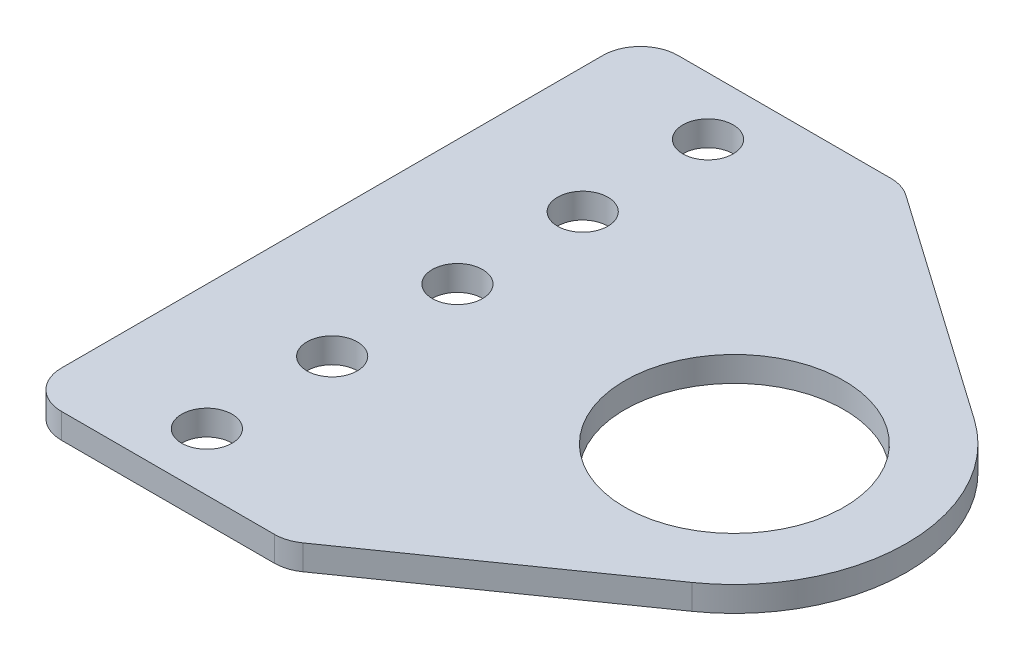
ISO-10303-21;
HEADER;
FILE_DESCRIPTION(('STEP AP214'),'2;1');
FILE_NAME('part.step','',(''),(''),'','','');
FILE_SCHEMA(('AUTOMOTIVE_DESIGN { 1 0 10303 214 1 1 1 1 }'));
ENDSEC;
DATA;
#1=APPLICATION_CONTEXT('core data for automotive mechanical design processes');
#2=APPLICATION_PROTOCOL_DEFINITION('international standard','automotive_design',2000,#1);
#3=PRODUCT_CONTEXT('',#1,'mechanical');
#4=PRODUCT('Part','Part','',(#3));
#5=PRODUCT_RELATED_PRODUCT_CATEGORY('part','',(#4));
#6=PRODUCT_DEFINITION_FORMATION('','',#4);
#7=PRODUCT_DEFINITION_CONTEXT('part definition',#1,'design');
#8=PRODUCT_DEFINITION('design','',#6,#7);
#9=PRODUCT_DEFINITION_SHAPE('','',#8);
#10=(LENGTH_UNIT() NAMED_UNIT(*) SI_UNIT(.MILLI.,.METRE.));
#11=(NAMED_UNIT(*) PLANE_ANGLE_UNIT() SI_UNIT($,.RADIAN.));
#12=(NAMED_UNIT(*) SI_UNIT($,.STERADIAN.) SOLID_ANGLE_UNIT());
#13=UNCERTAINTY_MEASURE_WITH_UNIT(LENGTH_MEASURE(1.E-05),#10,'distance_accuracy_value','');
#14=(GEOMETRIC_REPRESENTATION_CONTEXT(3) GLOBAL_UNCERTAINTY_ASSIGNED_CONTEXT((#13)) GLOBAL_UNIT_ASSIGNED_CONTEXT((#10,
#11,#12)) REPRESENTATION_CONTEXT('',''));
#15=CARTESIAN_POINT('',(0.,0.,0.));
#16=DIRECTION('',(0.,0.,1.));
#17=DIRECTION('',(1.,0.,0.));
#18=AXIS2_PLACEMENT_3D('',#15,#16,#17);
#19=CARTESIAN_POINT('',(-15.375,2.54,27.44));
#20=DIRECTION('',(0.,1.,0.));
#21=DIRECTION('',(0.,0.,1.));
#22=AXIS2_PLACEMENT_3D('',#19,#20,#21);
#23=PLANE('',#22);
#24=CARTESIAN_POINT('',(-28.075,2.54,12.7));
#25=DIRECTION('',(0.,1.,0.));
#26=DIRECTION('',(0.,0.,1.));
#27=AXIS2_PLACEMENT_3D('',#24,#25,#26);
#28=CIRCLE('',#27,2.5527);
#29=CARTESIAN_POINT('',(-28.075,2.54,15.2527));
#30=VERTEX_POINT('',#29);
#31=EDGE_CURVE('E279',#30,#30,#28,.T.);
#32=ORIENTED_EDGE('',*,*,#31,.F.);
#33=EDGE_LOOP('',(#32));
#34=FACE_BOUND('',#33,.T.);
#35=CARTESIAN_POINT('',(-28.075,2.54,-12.7));
#36=DIRECTION('',(0.,1.,0.));
#37=DIRECTION('',(0.,0.,1.));
#38=AXIS2_PLACEMENT_3D('',#35,#36,#37);
#39=CIRCLE('',#38,2.5527);
#40=CARTESIAN_POINT('',(-28.075,2.54,-10.1473));
#41=VERTEX_POINT('',#40);
#42=EDGE_CURVE('E263',#41,#41,#39,.T.);
#43=ORIENTED_EDGE('',*,*,#42,.F.);
#44=EDGE_LOOP('',(#43));
#45=FACE_BOUND('',#44,.T.);
#46=CARTESIAN_POINT('',(0.,2.54,0.));
#47=DIRECTION('',(0.,1.,0.));
#48=DIRECTION('',(0.,0.,1.));
#49=AXIS2_PLACEMENT_3D('',#46,#47,#48);
#50=CIRCLE('',#49,11.1125);
#51=CARTESIAN_POINT('',(0.,2.54,11.1125));
#52=VERTEX_POINT('',#51);
#53=EDGE_CURVE('E159',#52,#52,#50,.T.);
#54=ORIENTED_EDGE('',*,*,#53,.F.);
#55=EDGE_LOOP('',(#54));
#56=FACE_BOUND('',#55,.T.);
#57=CARTESIAN_POINT('',(-15.375,2.54,27.44));
#58=DIRECTION('',(0.,1.,0.));
#59=DIRECTION('',(0.,0.,1.));
#60=AXIS2_PLACEMENT_3D('',#57,#58,#59);
#61=CIRCLE('',#60,3.81);
#62=CARTESIAN_POINT('',(-15.375,2.54,31.25));
#63=VERTEX_POINT('',#62);
#64=CARTESIAN_POINT('',(-13.1889805318271,2.54,30.5604837581326));
#65=VERTEX_POINT('',#64);
#66=EDGE_CURVE('E183',#63,#65,#61,.T.);
#67=ORIENTED_EDGE('',*,*,#66,.T.);
#68=DIRECTION('',(0.819024608433747,0.,-0.573758390596553));
#69=VECTOR('',#68,1.);
#70=CARTESIAN_POINT('',(-13.1889805318271,2.54,30.5604837581326));
#71=LINE('',#70,#69);
#72=CARTESIAN_POINT('',(10.0192558957923,2.54,14.3022172247743));
#73=VERTEX_POINT('',#72);
#74=EDGE_CURVE('E106',#65,#73,#71,.T.);
#75=ORIENTED_EDGE('',*,*,#74,.T.);
#76=CARTESIAN_POINT('',(0.,2.54,0.));
#77=DIRECTION('',(0.,1.,0.));
#78=DIRECTION('',(0.,0.,1.));
#79=AXIS2_PLACEMENT_3D('',#76,#77,#78);
#80=CIRCLE('',#79,17.4625);
#81=CARTESIAN_POINT('',(10.0192558957923,2.54,-14.3022172247743));
#82=VERTEX_POINT('',#81);
#83=EDGE_CURVE('E213',#73,#82,#80,.T.);
#84=ORIENTED_EDGE('',*,*,#83,.T.);
#85=DIRECTION('',(-0.819024608433748,0.,-0.573758390596553));
#86=VECTOR('',#85,1.);
#87=CARTESIAN_POINT('',(10.0192558957923,2.54,-14.3022172247743));
#88=LINE('',#87,#86);
#89=CARTESIAN_POINT('',(-13.1889805318271,2.54,-30.5604837581326));
#90=VERTEX_POINT('',#89);
#91=EDGE_CURVE('E233',#82,#90,#88,.T.);
#92=ORIENTED_EDGE('',*,*,#91,.T.);
#93=CARTESIAN_POINT('',(-15.375,2.54,-27.44));
#94=DIRECTION('',(0.,1.,0.));
#95=DIRECTION('',(0.,0.,-1.));
#96=AXIS2_PLACEMENT_3D('',#93,#94,#95);
#97=CIRCLE('',#96,3.81);
#98=CARTESIAN_POINT('',(-15.375,2.54,-31.25));
#99=VERTEX_POINT('',#98);
#100=EDGE_CURVE('E229',#90,#99,#97,.T.);
#101=ORIENTED_EDGE('',*,*,#100,.T.);
#102=DIRECTION('',(-1.,0.,0.));
#103=VECTOR('',#102,1.);
#104=CARTESIAN_POINT('',(-36.965,2.54,-31.25));
#105=LINE('',#104,#103);
#106=CARTESIAN_POINT('',(-36.965,2.54,-31.25));
#107=VERTEX_POINT('',#106);
#108=EDGE_CURVE('E232',#99,#107,#105,.T.);
#109=ORIENTED_EDGE('',*,*,#108,.T.);
#110=CARTESIAN_POINT('',(-36.965,2.54,-27.44));
#111=DIRECTION('',(0.,1.,0.));
#112=DIRECTION('',(0.,0.,1.));
#113=AXIS2_PLACEMENT_3D('',#110,#111,#112);
#114=CIRCLE('',#113,3.81);
#115=CARTESIAN_POINT('',(-40.775,2.54,-27.44));
#116=VERTEX_POINT('',#115);
#117=EDGE_CURVE('E131',#107,#116,#114,.T.);
#118=ORIENTED_EDGE('',*,*,#117,.T.);
#119=DIRECTION('',(0.,0.,1.));
#120=VECTOR('',#119,1.);
#121=CARTESIAN_POINT('',(-40.775,2.54,27.44));
#122=LINE('',#121,#120);
#123=CARTESIAN_POINT('',(-40.775,2.54,27.44));
#124=VERTEX_POINT('',#123);
#125=EDGE_CURVE('E125',#116,#124,#122,.T.);
#126=ORIENTED_EDGE('',*,*,#125,.T.);
#127=CARTESIAN_POINT('',(-36.965,2.54,27.44));
#128=DIRECTION('',(0.,1.,0.));
#129=DIRECTION('',(0.,0.,1.));
#130=AXIS2_PLACEMENT_3D('',#127,#128,#129);
#131=CIRCLE('',#130,3.81);
#132=CARTESIAN_POINT('',(-36.965,2.54,31.25));
#133=VERTEX_POINT('',#132);
#134=EDGE_CURVE('E129',#124,#133,#131,.T.);
#135=ORIENTED_EDGE('',*,*,#134,.T.);
#136=DIRECTION('',(1.,0.,0.));
#137=VECTOR('',#136,1.);
#138=CARTESIAN_POINT('',(-15.375,2.54,31.25));
#139=LINE('',#138,#137);
#140=EDGE_CURVE('E57',#133,#63,#139,.T.);
#141=ORIENTED_EDGE('',*,*,#140,.T.);
#142=EDGE_LOOP('',(#67,#75,#84,#92,#101,#109,#118,#126,#135,#141));
#143=FACE_BOUND('',#142,.T.);
#144=CARTESIAN_POINT('',(-28.075,2.54,-25.4));
#145=DIRECTION('',(0.,1.,0.));
#146=DIRECTION('',(0.,0.,1.));
#147=AXIS2_PLACEMENT_3D('',#144,#145,#146);
#148=CIRCLE('',#147,2.5527);
#149=CARTESIAN_POINT('',(-28.075,2.54,-22.8473));
#150=VERTEX_POINT('',#149);
#151=EDGE_CURVE('E255',#150,#150,#148,.T.);
#152=ORIENTED_EDGE('',*,*,#151,.F.);
#153=EDGE_LOOP('',(#152));
#154=FACE_BOUND('',#153,.T.);
#155=CARTESIAN_POINT('',(-28.075,2.54,0.));
#156=DIRECTION('',(0.,1.,0.));
#157=DIRECTION('',(0.,0.,1.));
#158=AXIS2_PLACEMENT_3D('',#155,#156,#157);
#159=CIRCLE('',#158,2.55269999999999);
#160=CARTESIAN_POINT('',(-28.075,2.54,2.55269999999999));
#161=VERTEX_POINT('',#160);
#162=EDGE_CURVE('E271',#161,#161,#159,.T.);
#163=ORIENTED_EDGE('',*,*,#162,.F.);
#164=EDGE_LOOP('',(#163));
#165=FACE_BOUND('',#164,.T.);
#166=CARTESIAN_POINT('',(-28.075,2.54,25.4));
#167=DIRECTION('',(0.,1.,0.));
#168=DIRECTION('',(0.,0.,1.));
#169=AXIS2_PLACEMENT_3D('',#166,#167,#168);
#170=CIRCLE('',#169,2.5527);
#171=CARTESIAN_POINT('',(-28.075,2.54,27.9527));
#172=VERTEX_POINT('',#171);
#173=EDGE_CURVE('E287',#172,#172,#170,.T.);
#174=ORIENTED_EDGE('',*,*,#173,.F.);
#175=EDGE_LOOP('',(#174));
#176=FACE_BOUND('',#175,.T.);
#177=ADVANCED_FACE('F39',(#34,#45,#56,#143,#154,#165,#176),#23,.T.);
#178=CARTESIAN_POINT('',(-15.375,0.,27.44));
#179=DIRECTION('',(0.,1.,0.));
#180=DIRECTION('',(0.,0.,1.));
#181=AXIS2_PLACEMENT_3D('',#178,#179,#180);
#182=PLANE('',#181);
#183=CARTESIAN_POINT('',(-15.375,0.,27.44));
#184=DIRECTION('',(0.,1.,0.));
#185=DIRECTION('',(0.,0.,1.));
#186=AXIS2_PLACEMENT_3D('',#183,#184,#185);
#187=CIRCLE('',#186,3.81);
#188=CARTESIAN_POINT('',(-15.375,0.,31.25));
#189=VERTEX_POINT('',#188);
#190=CARTESIAN_POINT('',(-13.1889805318271,0.,30.5604837581326));
#191=VERTEX_POINT('',#190);
#192=EDGE_CURVE('E154',#189,#191,#187,.T.);
#193=ORIENTED_EDGE('',*,*,#192,.F.);
#194=DIRECTION('',(1.,0.,0.));
#195=VECTOR('',#194,1.);
#196=CARTESIAN_POINT('',(-15.375,0.,31.25));
#197=LINE('',#196,#195);
#198=CARTESIAN_POINT('',(-36.965,0.,31.25));
#199=VERTEX_POINT('',#198);
#200=EDGE_CURVE('E98',#199,#189,#197,.T.);
#201=ORIENTED_EDGE('',*,*,#200,.F.);
#202=CARTESIAN_POINT('',(-36.965,0.,27.44));
#203=DIRECTION('',(0.,1.,0.));
#204=DIRECTION('',(0.,0.,1.));
#205=AXIS2_PLACEMENT_3D('',#202,#203,#204);
#206=CIRCLE('',#205,3.81);
#207=CARTESIAN_POINT('',(-40.775,0.,27.44));
#208=VERTEX_POINT('',#207);
#209=EDGE_CURVE('E92',#208,#199,#206,.T.);
#210=ORIENTED_EDGE('',*,*,#209,.F.);
#211=DIRECTION('',(0.,0.,1.));
#212=VECTOR('',#211,1.);
#213=CARTESIAN_POINT('',(-40.775,0.,27.44));
#214=LINE('',#213,#212);
#215=CARTESIAN_POINT('',(-40.775,0.,-27.44));
#216=VERTEX_POINT('',#215);
#217=EDGE_CURVE('E140',#216,#208,#214,.T.);
#218=ORIENTED_EDGE('',*,*,#217,.F.);
#219=CARTESIAN_POINT('',(-36.965,0.,-27.44));
#220=DIRECTION('',(0.,1.,0.));
#221=DIRECTION('',(0.,0.,1.));
#222=AXIS2_PLACEMENT_3D('',#219,#220,#221);
#223=CIRCLE('',#222,3.81);
#224=CARTESIAN_POINT('',(-36.965,0.,-31.25));
#225=VERTEX_POINT('',#224);
#226=EDGE_CURVE('E174',#225,#216,#223,.T.);
#227=ORIENTED_EDGE('',*,*,#226,.F.);
#228=DIRECTION('',(-1.,0.,0.));
#229=VECTOR('',#228,1.);
#230=CARTESIAN_POINT('',(-36.965,0.,-31.25));
#231=LINE('',#230,#229);
#232=CARTESIAN_POINT('',(-15.375,0.,-31.25));
#233=VERTEX_POINT('',#232);
#234=EDGE_CURVE('E171',#233,#225,#231,.T.);
#235=ORIENTED_EDGE('',*,*,#234,.F.);
#236=CARTESIAN_POINT('',(-15.375,0.,-27.44));
#237=DIRECTION('',(0.,1.,0.));
#238=DIRECTION('',(0.,0.,-1.));
#239=AXIS2_PLACEMENT_3D('',#236,#237,#238);
#240=CIRCLE('',#239,3.81);
#241=CARTESIAN_POINT('',(-13.1889805318271,0.,-30.5604837581326));
#242=VERTEX_POINT('',#241);
#243=EDGE_CURVE('E168',#242,#233,#240,.T.);
#244=ORIENTED_EDGE('',*,*,#243,.F.);
#245=DIRECTION('',(-0.819024608433748,0.,-0.573758390596553));
#246=VECTOR('',#245,1.);
#247=CARTESIAN_POINT('',(10.0192558957923,0.,-14.3022172247743));
#248=LINE('',#247,#246);
#249=CARTESIAN_POINT('',(10.0192558957923,0.,-14.3022172247743));
#250=VERTEX_POINT('',#249);
#251=EDGE_CURVE('E165',#250,#242,#248,.T.);
#252=ORIENTED_EDGE('',*,*,#251,.F.);
#253=CARTESIAN_POINT('',(0.,0.,0.));
#254=DIRECTION('',(0.,1.,0.));
#255=DIRECTION('',(0.,0.,1.));
#256=AXIS2_PLACEMENT_3D('',#253,#254,#255);
#257=CIRCLE('',#256,17.4625);
#258=CARTESIAN_POINT('',(10.0192558957923,0.,14.3022172247743));
#259=VERTEX_POINT('',#258);
#260=EDGE_CURVE('E162',#259,#250,#257,.T.);
#261=ORIENTED_EDGE('',*,*,#260,.F.);
#262=DIRECTION('',(0.819024608433747,0.,-0.573758390596553));
#263=VECTOR('',#262,1.);
#264=CARTESIAN_POINT('',(-13.1889805318271,0.,30.5604837581326));
#265=LINE('',#264,#263);
#266=EDGE_CURVE('E158',#191,#259,#265,.T.);
#267=ORIENTED_EDGE('',*,*,#266,.F.);
#268=EDGE_LOOP('',(#193,#201,#210,#218,#227,#235,#244,#252,#261,#267));
#269=FACE_BOUND('',#268,.T.);
#270=CARTESIAN_POINT('',(0.,0.,0.));
#271=DIRECTION('',(0.,1.,0.));
#272=DIRECTION('',(0.,0.,1.));
#273=AXIS2_PLACEMENT_3D('',#270,#271,#272);
#274=CIRCLE('',#273,11.1125);
#275=CARTESIAN_POINT('',(0.,0.,11.1125));
#276=VERTEX_POINT('',#275);
#277=EDGE_CURVE('E251',#276,#276,#274,.T.);
#278=ORIENTED_EDGE('',*,*,#277,.T.);
#279=EDGE_LOOP('',(#278));
#280=FACE_BOUND('',#279,.T.);
#281=CARTESIAN_POINT('',(-28.075,0.,-25.4));
#282=DIRECTION('',(0.,1.,0.));
#283=DIRECTION('',(0.,0.,1.));
#284=AXIS2_PLACEMENT_3D('',#281,#282,#283);
#285=CIRCLE('',#284,2.5527);
#286=CARTESIAN_POINT('',(-28.075,0.,-22.8473));
#287=VERTEX_POINT('',#286);
#288=EDGE_CURVE('E259',#287,#287,#285,.T.);
#289=ORIENTED_EDGE('',*,*,#288,.T.);
#290=EDGE_LOOP('',(#289));
#291=FACE_BOUND('',#290,.T.);
#292=CARTESIAN_POINT('',(-28.075,0.,-12.7));
#293=DIRECTION('',(0.,1.,0.));
#294=DIRECTION('',(0.,0.,1.));
#295=AXIS2_PLACEMENT_3D('',#292,#293,#294);
#296=CIRCLE('',#295,2.5527);
#297=CARTESIAN_POINT('',(-28.075,0.,-10.1473));
#298=VERTEX_POINT('',#297);
#299=EDGE_CURVE('E267',#298,#298,#296,.T.);
#300=ORIENTED_EDGE('',*,*,#299,.T.);
#301=EDGE_LOOP('',(#300));
#302=FACE_BOUND('',#301,.T.);
#303=CARTESIAN_POINT('',(-28.075,0.,0.));
#304=DIRECTION('',(0.,1.,0.));
#305=DIRECTION('',(0.,0.,1.));
#306=AXIS2_PLACEMENT_3D('',#303,#304,#305);
#307=CIRCLE('',#306,2.55269999999999);
#308=CARTESIAN_POINT('',(-28.075,0.,2.55269999999999));
#309=VERTEX_POINT('',#308);
#310=EDGE_CURVE('E275',#309,#309,#307,.T.);
#311=ORIENTED_EDGE('',*,*,#310,.T.);
#312=EDGE_LOOP('',(#311));
#313=FACE_BOUND('',#312,.T.);
#314=CARTESIAN_POINT('',(-28.075,0.,12.7));
#315=DIRECTION('',(0.,1.,0.));
#316=DIRECTION('',(0.,0.,1.));
#317=AXIS2_PLACEMENT_3D('',#314,#315,#316);
#318=CIRCLE('',#317,2.5527);
#319=CARTESIAN_POINT('',(-28.075,0.,15.2527));
#320=VERTEX_POINT('',#319);
#321=EDGE_CURVE('E283',#320,#320,#318,.T.);
#322=ORIENTED_EDGE('',*,*,#321,.T.);
#323=EDGE_LOOP('',(#322));
#324=FACE_BOUND('',#323,.T.);
#325=CARTESIAN_POINT('',(-28.075,0.,25.4));
#326=DIRECTION('',(0.,1.,0.));
#327=DIRECTION('',(0.,0.,1.));
#328=AXIS2_PLACEMENT_3D('',#325,#326,#327);
#329=CIRCLE('',#328,2.5527);
#330=CARTESIAN_POINT('',(-28.075,0.,27.9527));
#331=VERTEX_POINT('',#330);
#332=EDGE_CURVE('E291',#331,#331,#329,.T.);
#333=ORIENTED_EDGE('',*,*,#332,.T.);
#334=EDGE_LOOP('',(#333));
#335=FACE_BOUND('',#334,.T.);
#336=ADVANCED_FACE('F217',(#269,#280,#291,#302,#313,#324,#335),#182,.F.);
#337=CARTESIAN_POINT('',(-15.375,2.54,27.44));
#338=DIRECTION('',(0.,-1.,0.));
#339=DIRECTION('',(0.,0.,-1.));
#340=AXIS2_PLACEMENT_3D('',#337,#338,#339);
#341=CYLINDRICAL_SURFACE('',#340,3.81);
#342=ORIENTED_EDGE('',*,*,#192,.T.);
#343=DIRECTION('',(0.,-1.,0.));
#344=VECTOR('',#343,1.);
#345=CARTESIAN_POINT('',(-13.1889805318271,2.54,30.5604837581326));
#346=LINE('',#345,#344);
#347=EDGE_CURVE('E11',#65,#191,#346,.T.);
#348=ORIENTED_EDGE('',*,*,#347,.F.);
#349=ORIENTED_EDGE('',*,*,#66,.F.);
#350=DIRECTION('',(0.,-1.,0.));
#351=VECTOR('',#350,1.);
#352=CARTESIAN_POINT('',(-15.375,2.54,31.25));
#353=LINE('',#352,#351);
#354=EDGE_CURVE('E150',#63,#189,#353,.T.);
#355=ORIENTED_EDGE('',*,*,#354,.T.);
#356=EDGE_LOOP('',(#342,#348,#349,#355));
#357=FACE_BOUND('',#356,.T.);
#358=ADVANCED_FACE('F41',(#357),#341,.T.);
#359=CARTESIAN_POINT('',(-13.1889805318271,2.54,30.5604837581326));
#360=DIRECTION('',(-0.573758390596553,0.,-0.819024608433747));
#361=DIRECTION('',(-0.819024608433747,0.,0.573758390596553));
#362=AXIS2_PLACEMENT_3D('',#359,#360,#361);
#363=PLANE('',#362);
#364=ORIENTED_EDGE('',*,*,#266,.T.);
#365=DIRECTION('',(0.,-1.,0.));
#366=VECTOR('',#365,1.);
#367=CARTESIAN_POINT('',(10.0192558957923,2.54,14.3022172247743));
#368=LINE('',#367,#366);
#369=EDGE_CURVE('E49',#73,#259,#368,.T.);
#370=ORIENTED_EDGE('',*,*,#369,.F.);
#371=ORIENTED_EDGE('',*,*,#74,.F.);
#372=ORIENTED_EDGE('',*,*,#347,.T.);
#373=EDGE_LOOP('',(#364,#370,#371,#372));
#374=FACE_BOUND('',#373,.T.);
#375=ADVANCED_FACE('F336',(#374),#363,.F.);
#376=CARTESIAN_POINT('',(0.,2.54,0.));
#377=DIRECTION('',(0.,-1.,0.));
#378=DIRECTION('',(0.,0.,-1.));
#379=AXIS2_PLACEMENT_3D('',#376,#377,#378);
#380=CYLINDRICAL_SURFACE('',#379,17.4625);
#381=ORIENTED_EDGE('',*,*,#260,.T.);
#382=DIRECTION('',(0.,-1.,0.));
#383=VECTOR('',#382,1.);
#384=CARTESIAN_POINT('',(10.0192558957923,2.54,-14.3022172247743));
#385=LINE('',#384,#383);
#386=EDGE_CURVE('E202',#82,#250,#385,.T.);
#387=ORIENTED_EDGE('',*,*,#386,.F.);
#388=ORIENTED_EDGE('',*,*,#83,.F.);
#389=ORIENTED_EDGE('',*,*,#369,.T.);
#390=EDGE_LOOP('',(#381,#387,#388,#389));
#391=FACE_BOUND('',#390,.T.);
#392=ADVANCED_FACE('F211',(#391),#380,.T.);
#393=CARTESIAN_POINT('',(10.0192558957923,2.54,-14.3022172247743));
#394=DIRECTION('',(-0.573758390596553,0.,0.819024608433748));
#395=DIRECTION('',(0.819024608433748,0.,0.573758390596553));
#396=AXIS2_PLACEMENT_3D('',#393,#394,#395);
#397=PLANE('',#396);
#398=ORIENTED_EDGE('',*,*,#251,.T.);
#399=DIRECTION('',(0.,-1.,0.));
#400=VECTOR('',#399,1.);
#401=CARTESIAN_POINT('',(-13.1889805318271,2.54,-30.5604837581326));
#402=LINE('',#401,#400);
#403=EDGE_CURVE('E198',#90,#242,#402,.T.);
#404=ORIENTED_EDGE('',*,*,#403,.F.);
#405=ORIENTED_EDGE('',*,*,#91,.F.);
#406=ORIENTED_EDGE('',*,*,#386,.T.);
#407=EDGE_LOOP('',(#398,#404,#405,#406));
#408=FACE_BOUND('',#407,.T.);
#409=ADVANCED_FACE('F223',(#408),#397,.F.);
#410=CARTESIAN_POINT('',(-15.375,2.54,-27.44));
#411=DIRECTION('',(0.,-1.,0.));
#412=DIRECTION('',(0.,0.,-1.));
#413=AXIS2_PLACEMENT_3D('',#410,#411,#412);
#414=CYLINDRICAL_SURFACE('',#413,3.81);
#415=ORIENTED_EDGE('',*,*,#243,.T.);
#416=DIRECTION('',(0.,-1.,0.));
#417=VECTOR('',#416,1.);
#418=CARTESIAN_POINT('',(-15.375,2.54,-31.25));
#419=LINE('',#418,#417);
#420=EDGE_CURVE('E194',#99,#233,#419,.T.);
#421=ORIENTED_EDGE('',*,*,#420,.F.);
#422=ORIENTED_EDGE('',*,*,#100,.F.);
#423=ORIENTED_EDGE('',*,*,#403,.T.);
#424=EDGE_LOOP('',(#415,#421,#422,#423));
#425=FACE_BOUND('',#424,.T.);
#426=ADVANCED_FACE('F227',(#425),#414,.T.);
#427=CARTESIAN_POINT('',(-36.965,2.54,-31.25));
#428=DIRECTION('',(0.,0.,1.));
#429=DIRECTION('',(1.,0.,0.));
#430=AXIS2_PLACEMENT_3D('',#427,#428,#429);
#431=PLANE('',#430);
#432=ORIENTED_EDGE('',*,*,#234,.T.);
#433=DIRECTION('',(0.,-1.,0.));
#434=VECTOR('',#433,1.);
#435=CARTESIAN_POINT('',(-36.965,2.54,-31.25));
#436=LINE('',#435,#434);
#437=EDGE_CURVE('E190',#107,#225,#436,.T.);
#438=ORIENTED_EDGE('',*,*,#437,.F.);
#439=ORIENTED_EDGE('',*,*,#108,.F.);
#440=ORIENTED_EDGE('',*,*,#420,.T.);
#441=EDGE_LOOP('',(#432,#438,#439,#440));
#442=FACE_BOUND('',#441,.T.);
#443=ADVANCED_FACE('F326',(#442),#431,.F.);
#444=CARTESIAN_POINT('',(-36.965,2.54,-27.44));
#445=DIRECTION('',(0.,-1.,0.));
#446=DIRECTION('',(0.,0.,-1.));
#447=AXIS2_PLACEMENT_3D('',#444,#445,#446);
#448=CYLINDRICAL_SURFACE('',#447,3.81);
#449=ORIENTED_EDGE('',*,*,#226,.T.);
#450=DIRECTION('',(0.,-1.,0.));
#451=VECTOR('',#450,1.);
#452=CARTESIAN_POINT('',(-40.775,2.54,-27.44));
#453=LINE('',#452,#451);
#454=EDGE_CURVE('E142',#116,#216,#453,.T.);
#455=ORIENTED_EDGE('',*,*,#454,.F.);
#456=ORIENTED_EDGE('',*,*,#117,.F.);
#457=ORIENTED_EDGE('',*,*,#437,.T.);
#458=EDGE_LOOP('',(#449,#455,#456,#457));
#459=FACE_BOUND('',#458,.T.);
#460=ADVANCED_FACE('F323',(#459),#448,.T.);
#461=CARTESIAN_POINT('',(-40.775,2.54,27.44));
#462=DIRECTION('',(1.,0.,0.));
#463=DIRECTION('',(0.,0.,-1.));
#464=AXIS2_PLACEMENT_3D('',#461,#462,#463);
#465=PLANE('',#464);
#466=ORIENTED_EDGE('',*,*,#217,.T.);
#467=DIRECTION('',(0.,-1.,0.));
#468=VECTOR('',#467,1.);
#469=CARTESIAN_POINT('',(-40.775,2.54,27.44));
#470=LINE('',#469,#468);
#471=EDGE_CURVE('E137',#124,#208,#470,.T.);
#472=ORIENTED_EDGE('',*,*,#471,.F.);
#473=ORIENTED_EDGE('',*,*,#125,.F.);
#474=ORIENTED_EDGE('',*,*,#454,.T.);
#475=EDGE_LOOP('',(#466,#472,#473,#474));
#476=FACE_BOUND('',#475,.T.);
#477=ADVANCED_FACE('F138',(#476),#465,.F.);
#478=CARTESIAN_POINT('',(-36.965,2.54,27.44));
#479=DIRECTION('',(0.,-1.,0.));
#480=DIRECTION('',(0.,0.,-1.));
#481=AXIS2_PLACEMENT_3D('',#478,#479,#480);
#482=CYLINDRICAL_SURFACE('',#481,3.81);
#483=ORIENTED_EDGE('',*,*,#209,.T.);
#484=DIRECTION('',(0.,-1.,0.));
#485=VECTOR('',#484,1.);
#486=CARTESIAN_POINT('',(-36.965,2.54,31.25));
#487=LINE('',#486,#485);
#488=EDGE_CURVE('E143',#133,#199,#487,.T.);
#489=ORIENTED_EDGE('',*,*,#488,.F.);
#490=ORIENTED_EDGE('',*,*,#134,.F.);
#491=ORIENTED_EDGE('',*,*,#471,.T.);
#492=EDGE_LOOP('',(#483,#489,#490,#491));
#493=FACE_BOUND('',#492,.T.);
#494=ADVANCED_FACE('F145',(#493),#482,.T.);
#495=CARTESIAN_POINT('',(-15.375,2.54,31.25));
#496=DIRECTION('',(0.,0.,-1.));
#497=DIRECTION('',(-1.,0.,0.));
#498=AXIS2_PLACEMENT_3D('',#495,#496,#497);
#499=PLANE('',#498);
#500=ORIENTED_EDGE('',*,*,#200,.T.);
#501=ORIENTED_EDGE('',*,*,#354,.F.);
#502=ORIENTED_EDGE('',*,*,#140,.F.);
#503=ORIENTED_EDGE('',*,*,#488,.T.);
#504=EDGE_LOOP('',(#500,#501,#502,#503));
#505=FACE_BOUND('',#504,.T.);
#506=ADVANCED_FACE('F316',(#505),#499,.F.);
#507=CARTESIAN_POINT('',(0.,2.54,0.));
#508=DIRECTION('',(0.,-1.,0.));
#509=DIRECTION('',(0.,0.,-1.));
#510=AXIS2_PLACEMENT_3D('',#507,#508,#509);
#511=CYLINDRICAL_SURFACE('',#510,11.1125);
#512=ORIENTED_EDGE('',*,*,#53,.T.);
#513=EDGE_LOOP('',(#512));
#514=FACE_BOUND('',#513,.T.);
#515=ORIENTED_EDGE('',*,*,#277,.F.);
#516=EDGE_LOOP('',(#515));
#517=FACE_BOUND('',#516,.T.);
#518=ADVANCED_FACE('F313',(#514,#517),#511,.F.);
#519=CARTESIAN_POINT('',(-28.075,2.54,-25.4));
#520=DIRECTION('',(0.,-1.,0.));
#521=DIRECTION('',(0.,0.,-1.));
#522=AXIS2_PLACEMENT_3D('',#519,#520,#521);
#523=CYLINDRICAL_SURFACE('',#522,2.5527);
#524=ORIENTED_EDGE('',*,*,#151,.T.);
#525=EDGE_LOOP('',(#524));
#526=FACE_BOUND('',#525,.T.);
#527=ORIENTED_EDGE('',*,*,#288,.F.);
#528=EDGE_LOOP('',(#527));
#529=FACE_BOUND('',#528,.T.);
#530=ADVANCED_FACE('F412',(#526,#529),#523,.F.);
#531=CARTESIAN_POINT('',(-28.075,2.54,-12.7));
#532=DIRECTION('',(0.,-1.,0.));
#533=DIRECTION('',(0.,0.,-1.));
#534=AXIS2_PLACEMENT_3D('',#531,#532,#533);
#535=CYLINDRICAL_SURFACE('',#534,2.5527);
#536=ORIENTED_EDGE('',*,*,#42,.T.);
#537=EDGE_LOOP('',(#536));
#538=FACE_BOUND('',#537,.T.);
#539=ORIENTED_EDGE('',*,*,#299,.F.);
#540=EDGE_LOOP('',(#539));
#541=FACE_BOUND('',#540,.T.);
#542=ADVANCED_FACE('F420',(#538,#541),#535,.F.);
#543=CARTESIAN_POINT('',(-28.075,2.54,0.));
#544=DIRECTION('',(0.,-1.,0.));
#545=DIRECTION('',(0.,0.,-1.));
#546=AXIS2_PLACEMENT_3D('',#543,#544,#545);
#547=CYLINDRICAL_SURFACE('',#546,2.55269999999999);
#548=ORIENTED_EDGE('',*,*,#162,.T.);
#549=EDGE_LOOP('',(#548));
#550=FACE_BOUND('',#549,.T.);
#551=ORIENTED_EDGE('',*,*,#310,.F.);
#552=EDGE_LOOP('',(#551));
#553=FACE_BOUND('',#552,.T.);
#554=ADVANCED_FACE('F428',(#550,#553),#547,.F.);
#555=CARTESIAN_POINT('',(-28.075,2.54,12.7));
#556=DIRECTION('',(0.,-1.,0.));
#557=DIRECTION('',(0.,0.,-1.));
#558=AXIS2_PLACEMENT_3D('',#555,#556,#557);
#559=CYLINDRICAL_SURFACE('',#558,2.5527);
#560=ORIENTED_EDGE('',*,*,#31,.T.);
#561=EDGE_LOOP('',(#560));
#562=FACE_BOUND('',#561,.T.);
#563=ORIENTED_EDGE('',*,*,#321,.F.);
#564=EDGE_LOOP('',(#563));
#565=FACE_BOUND('',#564,.T.);
#566=ADVANCED_FACE('F437',(#562,#565),#559,.F.);
#567=CARTESIAN_POINT('',(-28.075,2.54,25.4));
#568=DIRECTION('',(0.,-1.,0.));
#569=DIRECTION('',(0.,0.,-1.));
#570=AXIS2_PLACEMENT_3D('',#567,#568,#569);
#571=CYLINDRICAL_SURFACE('',#570,2.5527);
#572=ORIENTED_EDGE('',*,*,#173,.T.);
#573=EDGE_LOOP('',(#572));
#574=FACE_BOUND('',#573,.T.);
#575=ORIENTED_EDGE('',*,*,#332,.F.);
#576=EDGE_LOOP('',(#575));
#577=FACE_BOUND('',#576,.T.);
#578=ADVANCED_FACE('F300',(#574,#577),#571,.F.);
#579=CLOSED_SHELL('',(#177,#336,#358,#375,#392,#409,#426,#443,#460,#477,#494,#506,#518,#530,
#542,#554,#566,#578));
#580=MANIFOLD_SOLID_BREP('B2',#579);
#581=ADVANCED_BREP_SHAPE_REPRESENTATION('',(#18,#580),#14);
#582=SHAPE_DEFINITION_REPRESENTATION(#9,#581);
ENDSEC;
END-ISO-10303-21;
